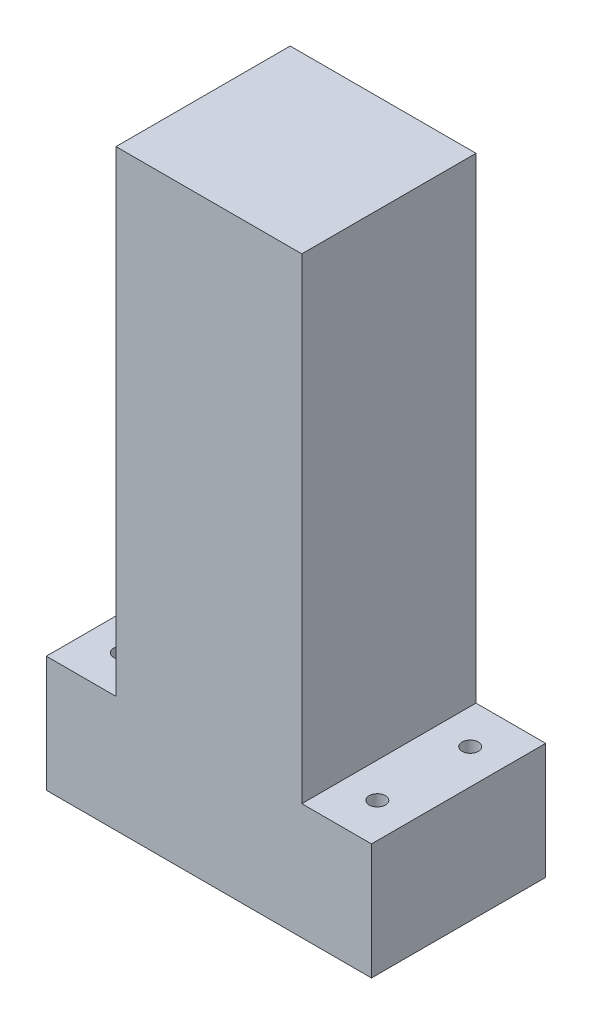
ISO-10303-21;
HEADER;
FILE_DESCRIPTION(('STEP AP214'),'2;1');
FILE_NAME('part.step','',(''),(''),'','','');
FILE_SCHEMA(('AUTOMOTIVE_DESIGN { 1 0 10303 214 1 1 1 1 }'));
ENDSEC;
DATA;
#1=APPLICATION_CONTEXT('core data for automotive mechanical design processes');
#2=APPLICATION_PROTOCOL_DEFINITION('international standard','automotive_design',2000,#1);
#3=PRODUCT_CONTEXT('',#1,'mechanical');
#4=PRODUCT('Part','Part','',(#3));
#5=PRODUCT_RELATED_PRODUCT_CATEGORY('part','',(#4));
#6=PRODUCT_DEFINITION_FORMATION('','',#4);
#7=PRODUCT_DEFINITION_CONTEXT('part definition',#1,'design');
#8=PRODUCT_DEFINITION('design','',#6,#7);
#9=PRODUCT_DEFINITION_SHAPE('','',#8);
#10=(LENGTH_UNIT() NAMED_UNIT(*) SI_UNIT(.MILLI.,.METRE.));
#11=(NAMED_UNIT(*) PLANE_ANGLE_UNIT() SI_UNIT($,.RADIAN.));
#12=(NAMED_UNIT(*) SI_UNIT($,.STERADIAN.) SOLID_ANGLE_UNIT());
#13=UNCERTAINTY_MEASURE_WITH_UNIT(LENGTH_MEASURE(1.E-05),#10,'distance_accuracy_value','');
#14=(GEOMETRIC_REPRESENTATION_CONTEXT(3) GLOBAL_UNCERTAINTY_ASSIGNED_CONTEXT((#13)) GLOBAL_UNIT_ASSIGNED_CONTEXT((#10,
#11,#12)) REPRESENTATION_CONTEXT('',''));
#15=CARTESIAN_POINT('',(0.,0.,0.));
#16=DIRECTION('',(0.,0.,1.));
#17=DIRECTION('',(1.,0.,0.));
#18=AXIS2_PLACEMENT_3D('',#15,#16,#17);
#19=CARTESIAN_POINT('',(0.,0.,150.));
#20=DIRECTION('',(0.,1.,0.));
#21=DIRECTION('',(0.,0.,1.));
#22=AXIS2_PLACEMENT_3D('',#19,#20,#21);
#23=PLANE('',#22);
#24=CARTESIAN_POINT('',(250.,0.,35.));
#25=DIRECTION('',(0.,-1.,0.));
#26=DIRECTION('',(0.,0.,-1.));
#27=AXIS2_PLACEMENT_3D('',#24,#25,#26);
#28=CIRCLE('',#27,7.);
#29=CARTESIAN_POINT('',(250.,0.,28.));
#30=VERTEX_POINT('',#29);
#31=EDGE_CURVE('E181',#30,#30,#28,.T.);
#32=ORIENTED_EDGE('',*,*,#31,.F.);
#33=EDGE_LOOP('',(#32));
#34=FACE_BOUND('',#33,.T.);
#35=CARTESIAN_POINT('',(250.,0.,115.));
#36=DIRECTION('',(0.,-1.,0.));
#37=DIRECTION('',(0.,0.,-1.));
#38=AXIS2_PLACEMENT_3D('',#35,#36,#37);
#39=CIRCLE('',#38,7.);
#40=CARTESIAN_POINT('',(250.,0.,108.));
#41=VERTEX_POINT('',#40);
#42=EDGE_CURVE('E187',#41,#41,#39,.T.);
#43=ORIENTED_EDGE('',*,*,#42,.F.);
#44=EDGE_LOOP('',(#43));
#45=FACE_BOUND('',#44,.T.);
#46=CARTESIAN_POINT('',(30.,0.,115.));
#47=DIRECTION('',(0.,-1.,0.));
#48=DIRECTION('',(0.,0.,-1.));
#49=AXIS2_PLACEMENT_3D('',#46,#47,#48);
#50=CIRCLE('',#49,7.);
#51=CARTESIAN_POINT('',(30.,0.,108.));
#52=VERTEX_POINT('',#51);
#53=EDGE_CURVE('E193',#52,#52,#50,.T.);
#54=ORIENTED_EDGE('',*,*,#53,.F.);
#55=EDGE_LOOP('',(#54));
#56=FACE_BOUND('',#55,.T.);
#57=DIRECTION('',(1.,0.,0.));
#58=VECTOR('',#57,1.);
#59=CARTESIAN_POINT('',(0.,0.,0.));
#60=LINE('',#59,#58);
#61=CARTESIAN_POINT('',(0.,0.,0.));
#62=VERTEX_POINT('',#61);
#63=CARTESIAN_POINT('',(280.,0.,0.));
#64=VERTEX_POINT('',#63);
#65=EDGE_CURVE('E136',#62,#64,#60,.T.);
#66=ORIENTED_EDGE('',*,*,#65,.T.);
#67=DIRECTION('',(0.,0.,-1.));
#68=VECTOR('',#67,1.);
#69=CARTESIAN_POINT('',(280.,0.,150.));
#70=LINE('',#69,#68);
#71=CARTESIAN_POINT('',(280.,0.,150.));
#72=VERTEX_POINT('',#71);
#73=EDGE_CURVE('E42',#72,#64,#70,.T.);
#74=ORIENTED_EDGE('',*,*,#73,.F.);
#75=DIRECTION('',(1.,0.,0.));
#76=VECTOR('',#75,1.);
#77=CARTESIAN_POINT('',(0.,0.,150.));
#78=LINE('',#77,#76);
#79=CARTESIAN_POINT('',(0.,0.,150.));
#80=VERTEX_POINT('',#79);
#81=EDGE_CURVE('E88',#80,#72,#78,.T.);
#82=ORIENTED_EDGE('',*,*,#81,.F.);
#83=DIRECTION('',(0.,0.,-1.));
#84=VECTOR('',#83,1.);
#85=CARTESIAN_POINT('',(0.,0.,150.));
#86=LINE('',#85,#84);
#87=EDGE_CURVE('E11',#80,#62,#86,.T.);
#88=ORIENTED_EDGE('',*,*,#87,.T.);
#89=EDGE_LOOP('',(#66,#74,#82,#88));
#90=FACE_BOUND('',#89,.T.);
#91=CARTESIAN_POINT('',(30.,0.,35.));
#92=DIRECTION('',(0.,-1.,0.));
#93=DIRECTION('',(0.,0.,-1.));
#94=AXIS2_PLACEMENT_3D('',#91,#92,#93);
#95=CIRCLE('',#94,7.);
#96=CARTESIAN_POINT('',(30.,0.,28.));
#97=VERTEX_POINT('',#96);
#98=EDGE_CURVE('E172',#97,#97,#95,.T.);
#99=ORIENTED_EDGE('',*,*,#98,.F.);
#100=EDGE_LOOP('',(#99));
#101=FACE_BOUND('',#100,.T.);
#102=ADVANCED_FACE('F33',(#34,#45,#56,#90,#101),#23,.F.);
#103=CARTESIAN_POINT('',(0.,0.,150.));
#104=DIRECTION('',(1.,0.,0.));
#105=DIRECTION('',(0.,0.,-1.));
#106=AXIS2_PLACEMENT_3D('',#103,#104,#105);
#107=PLANE('',#106);
#108=DIRECTION('',(0.,-1.,0.));
#109=VECTOR('',#108,1.);
#110=CARTESIAN_POINT('',(0.,0.,0.));
#111=LINE('',#110,#109);
#112=CARTESIAN_POINT('',(0.,100.,0.));
#113=VERTEX_POINT('',#112);
#114=EDGE_CURVE('E133',#113,#62,#111,.T.);
#115=ORIENTED_EDGE('',*,*,#114,.T.);
#116=ORIENTED_EDGE('',*,*,#87,.F.);
#117=DIRECTION('',(0.,-1.,0.));
#118=VECTOR('',#117,1.);
#119=CARTESIAN_POINT('',(0.,0.,150.));
#120=LINE('',#119,#118);
#121=CARTESIAN_POINT('',(0.,100.,150.));
#122=VERTEX_POINT('',#121);
#123=EDGE_CURVE('E146',#122,#80,#120,.T.);
#124=ORIENTED_EDGE('',*,*,#123,.F.);
#125=DIRECTION('',(0.,0.,-1.));
#126=VECTOR('',#125,1.);
#127=CARTESIAN_POINT('',(0.,100.,150.));
#128=LINE('',#127,#126);
#129=EDGE_CURVE('E132',#122,#113,#128,.T.);
#130=ORIENTED_EDGE('',*,*,#129,.T.);
#131=EDGE_LOOP('',(#115,#116,#124,#130));
#132=FACE_BOUND('',#131,.T.);
#133=ADVANCED_FACE('F35',(#132),#107,.F.);
#134=CARTESIAN_POINT('',(280.,0.,150.));
#135=DIRECTION('',(-1.,0.,0.));
#136=DIRECTION('',(0.,0.,1.));
#137=AXIS2_PLACEMENT_3D('',#134,#135,#136);
#138=PLANE('',#137);
#139=DIRECTION('',(0.,1.,0.));
#140=VECTOR('',#139,1.);
#141=CARTESIAN_POINT('',(280.,0.,0.));
#142=LINE('',#141,#140);
#143=CARTESIAN_POINT('',(280.,100.,0.));
#144=VERTEX_POINT('',#143);
#145=EDGE_CURVE('E139',#64,#144,#142,.T.);
#146=ORIENTED_EDGE('',*,*,#145,.T.);
#147=DIRECTION('',(0.,0.,-1.));
#148=VECTOR('',#147,1.);
#149=CARTESIAN_POINT('',(280.,100.,150.));
#150=LINE('',#149,#148);
#151=CARTESIAN_POINT('',(280.,100.,150.));
#152=VERTEX_POINT('',#151);
#153=EDGE_CURVE('E119',#152,#144,#150,.T.);
#154=ORIENTED_EDGE('',*,*,#153,.F.);
#155=DIRECTION('',(0.,1.,0.));
#156=VECTOR('',#155,1.);
#157=CARTESIAN_POINT('',(280.,0.,150.));
#158=LINE('',#157,#156);
#159=EDGE_CURVE('E106',#72,#152,#158,.T.);
#160=ORIENTED_EDGE('',*,*,#159,.F.);
#161=ORIENTED_EDGE('',*,*,#73,.T.);
#162=EDGE_LOOP('',(#146,#154,#160,#161));
#163=FACE_BOUND('',#162,.T.);
#164=ADVANCED_FACE('F152',(#163),#138,.F.);
#165=CARTESIAN_POINT('',(220.,100.,150.));
#166=DIRECTION('',(0.,-1.,0.));
#167=DIRECTION('',(0.,0.,-1.));
#168=AXIS2_PLACEMENT_3D('',#165,#166,#167);
#169=PLANE('',#168);
#170=CARTESIAN_POINT('',(250.,100.,35.));
#171=DIRECTION('',(0.,-1.,0.));
#172=DIRECTION('',(0.,0.,-1.));
#173=AXIS2_PLACEMENT_3D('',#170,#171,#172);
#174=CIRCLE('',#173,7.);
#175=CARTESIAN_POINT('',(250.,100.,28.));
#176=VERTEX_POINT('',#175);
#177=EDGE_CURVE('E184',#176,#176,#174,.T.);
#178=ORIENTED_EDGE('',*,*,#177,.T.);
#179=EDGE_LOOP('',(#178));
#180=FACE_BOUND('',#179,.T.);
#181=CARTESIAN_POINT('',(250.,100.,115.));
#182=DIRECTION('',(0.,-1.,0.));
#183=DIRECTION('',(0.,0.,-1.));
#184=AXIS2_PLACEMENT_3D('',#181,#182,#183);
#185=CIRCLE('',#184,7.);
#186=CARTESIAN_POINT('',(250.,100.,108.));
#187=VERTEX_POINT('',#186);
#188=EDGE_CURVE('E190',#187,#187,#185,.T.);
#189=ORIENTED_EDGE('',*,*,#188,.T.);
#190=EDGE_LOOP('',(#189));
#191=FACE_BOUND('',#190,.T.);
#192=DIRECTION('',(-1.,0.,0.));
#193=VECTOR('',#192,1.);
#194=CARTESIAN_POINT('',(220.,100.,0.));
#195=LINE('',#194,#193);
#196=CARTESIAN_POINT('',(220.,100.,0.));
#197=VERTEX_POINT('',#196);
#198=EDGE_CURVE('E115',#144,#197,#195,.T.);
#199=ORIENTED_EDGE('',*,*,#198,.T.);
#200=DIRECTION('',(0.,0.,-1.));
#201=VECTOR('',#200,1.);
#202=CARTESIAN_POINT('',(220.,100.,150.));
#203=LINE('',#202,#201);
#204=CARTESIAN_POINT('',(220.,100.,150.));
#205=VERTEX_POINT('',#204);
#206=EDGE_CURVE('E112',#205,#197,#203,.T.);
#207=ORIENTED_EDGE('',*,*,#206,.F.);
#208=DIRECTION('',(-1.,0.,0.));
#209=VECTOR('',#208,1.);
#210=CARTESIAN_POINT('',(220.,100.,150.));
#211=LINE('',#210,#209);
#212=EDGE_CURVE('E98',#152,#205,#211,.T.);
#213=ORIENTED_EDGE('',*,*,#212,.F.);
#214=ORIENTED_EDGE('',*,*,#153,.T.);
#215=EDGE_LOOP('',(#199,#207,#213,#214));
#216=FACE_BOUND('',#215,.T.);
#217=ADVANCED_FACE('F113',(#180,#191,#216),#169,.F.);
#218=CARTESIAN_POINT('',(220.,100.,150.));
#219=DIRECTION('',(-1.,0.,0.));
#220=DIRECTION('',(0.,0.,1.));
#221=AXIS2_PLACEMENT_3D('',#218,#219,#220);
#222=PLANE('',#221);
#223=DIRECTION('',(0.,1.,0.));
#224=VECTOR('',#223,1.);
#225=CARTESIAN_POINT('',(220.,100.,0.));
#226=LINE('',#225,#224);
#227=CARTESIAN_POINT('',(220.,510.,0.));
#228=VERTEX_POINT('',#227);
#229=EDGE_CURVE('E142',#197,#228,#226,.T.);
#230=ORIENTED_EDGE('',*,*,#229,.T.);
#231=DIRECTION('',(0.,0.,-1.));
#232=VECTOR('',#231,1.);
#233=CARTESIAN_POINT('',(220.,510.,150.));
#234=LINE('',#233,#232);
#235=CARTESIAN_POINT('',(220.,510.,150.));
#236=VERTEX_POINT('',#235);
#237=EDGE_CURVE('E125',#236,#228,#234,.T.);
#238=ORIENTED_EDGE('',*,*,#237,.F.);
#239=DIRECTION('',(0.,1.,0.));
#240=VECTOR('',#239,1.);
#241=CARTESIAN_POINT('',(220.,100.,150.));
#242=LINE('',#241,#240);
#243=EDGE_CURVE('E103',#205,#236,#242,.T.);
#244=ORIENTED_EDGE('',*,*,#243,.F.);
#245=ORIENTED_EDGE('',*,*,#206,.T.);
#246=EDGE_LOOP('',(#230,#238,#244,#245));
#247=FACE_BOUND('',#246,.T.);
#248=ADVANCED_FACE('F123',(#247),#222,.F.);
#249=CARTESIAN_POINT('',(60.,100.,150.));
#250=DIRECTION('',(1.,0.,0.));
#251=DIRECTION('',(0.,0.,-1.));
#252=AXIS2_PLACEMENT_3D('',#249,#250,#251);
#253=PLANE('',#252);
#254=DIRECTION('',(0.,-1.,0.));
#255=VECTOR('',#254,1.);
#256=CARTESIAN_POINT('',(60.,100.,0.));
#257=LINE('',#256,#255);
#258=CARTESIAN_POINT('',(60.,510.,0.));
#259=VERTEX_POINT('',#258);
#260=CARTESIAN_POINT('',(60.,100.,0.));
#261=VERTEX_POINT('',#260);
#262=EDGE_CURVE('E74',#259,#261,#257,.T.);
#263=ORIENTED_EDGE('',*,*,#262,.T.);
#264=DIRECTION('',(0.,0.,-1.));
#265=VECTOR('',#264,1.);
#266=CARTESIAN_POINT('',(60.,100.,150.));
#267=LINE('',#266,#265);
#268=CARTESIAN_POINT('',(60.,100.,150.));
#269=VERTEX_POINT('',#268);
#270=EDGE_CURVE('E120',#269,#261,#267,.T.);
#271=ORIENTED_EDGE('',*,*,#270,.F.);
#272=DIRECTION('',(0.,-1.,0.));
#273=VECTOR('',#272,1.);
#274=CARTESIAN_POINT('',(60.,100.,150.));
#275=LINE('',#274,#273);
#276=CARTESIAN_POINT('',(60.,510.,150.));
#277=VERTEX_POINT('',#276);
#278=EDGE_CURVE('E126',#277,#269,#275,.T.);
#279=ORIENTED_EDGE('',*,*,#278,.F.);
#280=DIRECTION('',(0.,0.,1.));
#281=VECTOR('',#280,1.);
#282=CARTESIAN_POINT('',(60.,510.,0.));
#283=LINE('',#282,#281);
#284=EDGE_CURVE('E167',#259,#277,#283,.T.);
#285=ORIENTED_EDGE('',*,*,#284,.F.);
#286=EDGE_LOOP('',(#263,#271,#279,#285));
#287=FACE_BOUND('',#286,.T.);
#288=ADVANCED_FACE('F166',(#287),#253,.F.);
#289=CARTESIAN_POINT('',(0.,100.,150.));
#290=DIRECTION('',(0.,-1.,0.));
#291=DIRECTION('',(0.,0.,-1.));
#292=AXIS2_PLACEMENT_3D('',#289,#290,#291);
#293=PLANE('',#292);
#294=CARTESIAN_POINT('',(30.,100.,35.));
#295=DIRECTION('',(0.,-1.,0.));
#296=DIRECTION('',(0.,0.,-1.));
#297=AXIS2_PLACEMENT_3D('',#294,#295,#296);
#298=CIRCLE('',#297,7.);
#299=CARTESIAN_POINT('',(30.,100.,28.));
#300=VERTEX_POINT('',#299);
#301=EDGE_CURVE('E175',#300,#300,#298,.T.);
#302=ORIENTED_EDGE('',*,*,#301,.T.);
#303=EDGE_LOOP('',(#302));
#304=FACE_BOUND('',#303,.T.);
#305=CARTESIAN_POINT('',(30.,100.,115.));
#306=DIRECTION('',(0.,-1.,0.));
#307=DIRECTION('',(0.,0.,-1.));
#308=AXIS2_PLACEMENT_3D('',#305,#306,#307);
#309=CIRCLE('',#308,7.);
#310=CARTESIAN_POINT('',(30.,100.,108.));
#311=VERTEX_POINT('',#310);
#312=EDGE_CURVE('E137',#311,#311,#309,.T.);
#313=ORIENTED_EDGE('',*,*,#312,.T.);
#314=EDGE_LOOP('',(#313));
#315=FACE_BOUND('',#314,.T.);
#316=DIRECTION('',(-1.,0.,0.));
#317=VECTOR('',#316,1.);
#318=CARTESIAN_POINT('',(0.,100.,0.));
#319=LINE('',#318,#317);
#320=EDGE_CURVE('E80',#261,#113,#319,.T.);
#321=ORIENTED_EDGE('',*,*,#320,.T.);
#322=ORIENTED_EDGE('',*,*,#129,.F.);
#323=DIRECTION('',(-1.,0.,0.));
#324=VECTOR('',#323,1.);
#325=CARTESIAN_POINT('',(0.,100.,150.));
#326=LINE('',#325,#324);
#327=EDGE_CURVE('E50',#269,#122,#326,.T.);
#328=ORIENTED_EDGE('',*,*,#327,.F.);
#329=ORIENTED_EDGE('',*,*,#270,.T.);
#330=EDGE_LOOP('',(#321,#322,#328,#329));
#331=FACE_BOUND('',#330,.T.);
#332=ADVANCED_FACE('F231',(#304,#315,#331),#293,.F.);
#333=CARTESIAN_POINT('',(0.,0.,150.));
#334=DIRECTION('',(0.,0.,-1.));
#335=DIRECTION('',(-1.,0.,0.));
#336=AXIS2_PLACEMENT_3D('',#333,#334,#335);
#337=PLANE('',#336);
#338=ORIENTED_EDGE('',*,*,#123,.T.);
#339=ORIENTED_EDGE('',*,*,#81,.T.);
#340=ORIENTED_EDGE('',*,*,#159,.T.);
#341=ORIENTED_EDGE('',*,*,#212,.T.);
#342=ORIENTED_EDGE('',*,*,#243,.T.);
#343=DIRECTION('',(1.,0.,0.));
#344=VECTOR('',#343,1.);
#345=CARTESIAN_POINT('',(60.,510.,150.));
#346=LINE('',#345,#344);
#347=EDGE_CURVE('E170',#277,#236,#346,.T.);
#348=ORIENTED_EDGE('',*,*,#347,.F.);
#349=ORIENTED_EDGE('',*,*,#278,.T.);
#350=ORIENTED_EDGE('',*,*,#327,.T.);
#351=EDGE_LOOP('',(#338,#339,#340,#341,#342,#348,#349,#350));
#352=FACE_BOUND('',#351,.T.);
#353=ADVANCED_FACE('F100',(#352),#337,.F.);
#354=CARTESIAN_POINT('',(0.,0.,0.));
#355=DIRECTION('',(0.,0.,-1.));
#356=DIRECTION('',(-1.,0.,0.));
#357=AXIS2_PLACEMENT_3D('',#354,#355,#356);
#358=PLANE('',#357);
#359=ORIENTED_EDGE('',*,*,#114,.F.);
#360=ORIENTED_EDGE('',*,*,#320,.F.);
#361=ORIENTED_EDGE('',*,*,#262,.F.);
#362=DIRECTION('',(-1.,0.,0.));
#363=VECTOR('',#362,1.);
#364=CARTESIAN_POINT('',(220.,510.,0.));
#365=LINE('',#364,#363);
#366=EDGE_CURVE('E159',#228,#259,#365,.T.);
#367=ORIENTED_EDGE('',*,*,#366,.F.);
#368=ORIENTED_EDGE('',*,*,#229,.F.);
#369=ORIENTED_EDGE('',*,*,#198,.F.);
#370=ORIENTED_EDGE('',*,*,#145,.F.);
#371=ORIENTED_EDGE('',*,*,#65,.F.);
#372=EDGE_LOOP('',(#359,#360,#361,#367,#368,#369,#370,#371));
#373=FACE_BOUND('',#372,.T.);
#374=ADVANCED_FACE('F155',(#373),#358,.T.);
#375=CARTESIAN_POINT('',(30.,0.,115.));
#376=DIRECTION('',(0.,-1.,0.));
#377=DIRECTION('',(0.,0.,-1.));
#378=AXIS2_PLACEMENT_3D('',#375,#376,#377);
#379=CYLINDRICAL_SURFACE('',#378,7.);
#380=ORIENTED_EDGE('',*,*,#312,.F.);
#381=EDGE_LOOP('',(#380));
#382=FACE_BOUND('',#381,.T.);
#383=ORIENTED_EDGE('',*,*,#53,.T.);
#384=EDGE_LOOP('',(#383));
#385=FACE_BOUND('',#384,.T.);
#386=ADVANCED_FACE('F224',(#382,#385),#379,.F.);
#387=CARTESIAN_POINT('',(250.,0.,115.));
#388=DIRECTION('',(0.,-1.,0.));
#389=DIRECTION('',(0.,0.,-1.));
#390=AXIS2_PLACEMENT_3D('',#387,#388,#389);
#391=CYLINDRICAL_SURFACE('',#390,7.);
#392=ORIENTED_EDGE('',*,*,#188,.F.);
#393=EDGE_LOOP('',(#392));
#394=FACE_BOUND('',#393,.T.);
#395=ORIENTED_EDGE('',*,*,#42,.T.);
#396=EDGE_LOOP('',(#395));
#397=FACE_BOUND('',#396,.T.);
#398=ADVANCED_FACE('F217',(#394,#397),#391,.F.);
#399=CARTESIAN_POINT('',(250.,0.,35.));
#400=DIRECTION('',(0.,-1.,0.));
#401=DIRECTION('',(0.,0.,-1.));
#402=AXIS2_PLACEMENT_3D('',#399,#400,#401);
#403=CYLINDRICAL_SURFACE('',#402,7.);
#404=ORIENTED_EDGE('',*,*,#177,.F.);
#405=EDGE_LOOP('',(#404));
#406=FACE_BOUND('',#405,.T.);
#407=ORIENTED_EDGE('',*,*,#31,.T.);
#408=EDGE_LOOP('',(#407));
#409=FACE_BOUND('',#408,.T.);
#410=ADVANCED_FACE('F209',(#406,#409),#403,.F.);
#411=CARTESIAN_POINT('',(30.,0.,35.));
#412=DIRECTION('',(0.,-1.,0.));
#413=DIRECTION('',(0.,0.,-1.));
#414=AXIS2_PLACEMENT_3D('',#411,#412,#413);
#415=CYLINDRICAL_SURFACE('',#414,7.);
#416=ORIENTED_EDGE('',*,*,#301,.F.);
#417=EDGE_LOOP('',(#416));
#418=FACE_BOUND('',#417,.T.);
#419=ORIENTED_EDGE('',*,*,#98,.T.);
#420=EDGE_LOOP('',(#419));
#421=FACE_BOUND('',#420,.T.);
#422=ADVANCED_FACE('F207',(#418,#421),#415,.F.);
#423=CARTESIAN_POINT('',(0.,510.,0.));
#424=DIRECTION('',(0.,1.,0.));
#425=DIRECTION('',(0.,0.,1.));
#426=AXIS2_PLACEMENT_3D('',#423,#424,#425);
#427=PLANE('',#426);
#428=ORIENTED_EDGE('',*,*,#237,.T.);
#429=ORIENTED_EDGE('',*,*,#366,.T.);
#430=ORIENTED_EDGE('',*,*,#284,.T.);
#431=ORIENTED_EDGE('',*,*,#347,.T.);
#432=EDGE_LOOP('',(#428,#429,#430,#431));
#433=FACE_BOUND('',#432,.T.);
#434=ADVANCED_FACE('F169',(#433),#427,.T.);
#435=CLOSED_SHELL('',(#102,#133,#164,#217,#248,#288,#332,#353,#374,#386,#398,#410,#422,#434));
#436=MANIFOLD_SOLID_BREP('B2',#435);
#437=ADVANCED_BREP_SHAPE_REPRESENTATION('',(#18,#436),#14);
#438=SHAPE_DEFINITION_REPRESENTATION(#9,#437);
ENDSEC;
END-ISO-10303-21;
